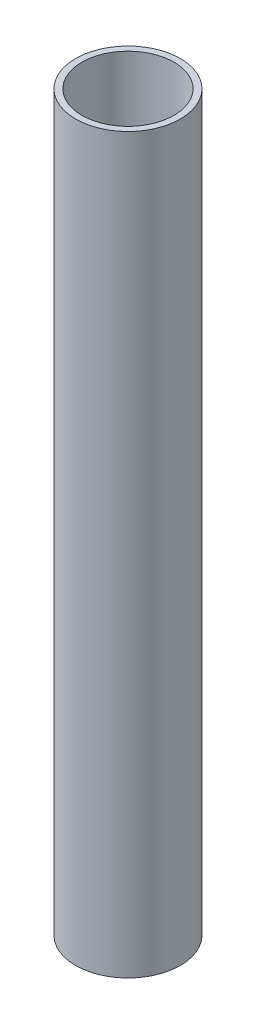
ISO-10303-21;
HEADER;
FILE_DESCRIPTION(('STEP AP214'),'2;1');
FILE_NAME('part.step','',(''),(''),'','','');
FILE_SCHEMA(('AUTOMOTIVE_DESIGN { 1 0 10303 214 1 1 1 1 }'));
ENDSEC;
DATA;
#1=APPLICATION_CONTEXT('core data for automotive mechanical design processes');
#2=APPLICATION_PROTOCOL_DEFINITION('international standard','automotive_design',2000,#1);
#3=PRODUCT_CONTEXT('',#1,'mechanical');
#4=PRODUCT('Part','Part','',(#3));
#5=PRODUCT_RELATED_PRODUCT_CATEGORY('part','',(#4));
#6=PRODUCT_DEFINITION_FORMATION('','',#4);
#7=PRODUCT_DEFINITION_CONTEXT('part definition',#1,'design');
#8=PRODUCT_DEFINITION('design','',#6,#7);
#9=PRODUCT_DEFINITION_SHAPE('','',#8);
#10=(LENGTH_UNIT() NAMED_UNIT(*) SI_UNIT(.MILLI.,.METRE.));
#11=(NAMED_UNIT(*) PLANE_ANGLE_UNIT() SI_UNIT($,.RADIAN.));
#12=(NAMED_UNIT(*) SI_UNIT($,.STERADIAN.) SOLID_ANGLE_UNIT());
#13=UNCERTAINTY_MEASURE_WITH_UNIT(LENGTH_MEASURE(1.E-05),#10,'distance_accuracy_value','');
#14=(GEOMETRIC_REPRESENTATION_CONTEXT(3) GLOBAL_UNCERTAINTY_ASSIGNED_CONTEXT((#13)) GLOBAL_UNIT_ASSIGNED_CONTEXT((#10,
#11,#12)) REPRESENTATION_CONTEXT('',''));
#15=CARTESIAN_POINT('',(0.,0.,0.));
#16=DIRECTION('',(0.,0.,1.));
#17=DIRECTION('',(1.,0.,0.));
#18=AXIS2_PLACEMENT_3D('',#15,#16,#17);
#19=CARTESIAN_POINT('',(0.,175.,0.));
#20=DIRECTION('',(0.,1.,0.));
#21=DIRECTION('',(0.,0.,1.));
#22=AXIS2_PLACEMENT_3D('',#19,#20,#21);
#23=PLANE('',#22);
#24=CARTESIAN_POINT('',(0.,175.,0.));
#25=DIRECTION('',(0.,1.,0.));
#26=DIRECTION('',(0.,0.,1.));
#27=AXIS2_PLACEMENT_3D('',#24,#25,#26);
#28=CIRCLE('',#27,12.5);
#29=CARTESIAN_POINT('',(0.,175.,12.5));
#30=VERTEX_POINT('',#29);
#31=EDGE_CURVE('E10',#30,#30,#28,.T.);
#32=ORIENTED_EDGE('',*,*,#31,.T.);
#33=EDGE_LOOP('',(#32));
#34=FACE_BOUND('',#33,.T.);
#35=CARTESIAN_POINT('',(0.,175.,0.));
#36=DIRECTION('',(0.,1.,0.));
#37=DIRECTION('',(0.,0.,1.));
#38=AXIS2_PLACEMENT_3D('',#35,#36,#37);
#39=CIRCLE('',#38,11.);
#40=CARTESIAN_POINT('',(0.,175.,11.));
#41=VERTEX_POINT('',#40);
#42=EDGE_CURVE('E42',#41,#41,#39,.T.);
#43=ORIENTED_EDGE('',*,*,#42,.F.);
#44=EDGE_LOOP('',(#43));
#45=FACE_BOUND('',#44,.T.);
#46=ADVANCED_FACE('F31',(#34,#45),#23,.T.);
#47=CARTESIAN_POINT('',(0.,0.,0.));
#48=DIRECTION('',(0.,1.,0.));
#49=DIRECTION('',(0.,0.,1.));
#50=AXIS2_PLACEMENT_3D('',#47,#48,#49);
#51=PLANE('',#50);
#52=CARTESIAN_POINT('',(0.,0.,0.));
#53=DIRECTION('',(0.,1.,0.));
#54=DIRECTION('',(0.,0.,1.));
#55=AXIS2_PLACEMENT_3D('',#52,#53,#54);
#56=CIRCLE('',#55,12.5);
#57=CARTESIAN_POINT('',(0.,0.,12.5));
#58=VERTEX_POINT('',#57);
#59=EDGE_CURVE('E35',#58,#58,#56,.T.);
#60=ORIENTED_EDGE('',*,*,#59,.F.);
#61=EDGE_LOOP('',(#60));
#62=FACE_BOUND('',#61,.T.);
#63=CARTESIAN_POINT('',(0.,0.,0.));
#64=DIRECTION('',(0.,1.,0.));
#65=DIRECTION('',(0.,0.,1.));
#66=AXIS2_PLACEMENT_3D('',#63,#64,#65);
#67=CIRCLE('',#66,11.);
#68=CARTESIAN_POINT('',(0.,0.,11.));
#69=VERTEX_POINT('',#68);
#70=EDGE_CURVE('E44',#69,#69,#67,.T.);
#71=ORIENTED_EDGE('',*,*,#70,.T.);
#72=EDGE_LOOP('',(#71));
#73=FACE_BOUND('',#72,.T.);
#74=ADVANCED_FACE('F54',(#62,#73),#51,.F.);
#75=CARTESIAN_POINT('',(0.,175.,0.));
#76=DIRECTION('',(0.,-1.,0.));
#77=DIRECTION('',(0.,0.,-1.));
#78=AXIS2_PLACEMENT_3D('',#75,#76,#77);
#79=CYLINDRICAL_SURFACE('',#78,12.5);
#80=ORIENTED_EDGE('',*,*,#31,.F.);
#81=EDGE_LOOP('',(#80));
#82=FACE_BOUND('',#81,.T.);
#83=ORIENTED_EDGE('',*,*,#59,.T.);
#84=EDGE_LOOP('',(#83));
#85=FACE_BOUND('',#84,.T.);
#86=ADVANCED_FACE('F33',(#82,#85),#79,.T.);
#87=CARTESIAN_POINT('',(0.,175.,0.));
#88=DIRECTION('',(0.,-1.,0.));
#89=DIRECTION('',(0.,0.,-1.));
#90=AXIS2_PLACEMENT_3D('',#87,#88,#89);
#91=CYLINDRICAL_SURFACE('',#90,11.);
#92=ORIENTED_EDGE('',*,*,#42,.T.);
#93=EDGE_LOOP('',(#92));
#94=FACE_BOUND('',#93,.T.);
#95=ORIENTED_EDGE('',*,*,#70,.F.);
#96=EDGE_LOOP('',(#95));
#97=FACE_BOUND('',#96,.T.);
#98=ADVANCED_FACE('F50',(#94,#97),#91,.F.);
#99=CLOSED_SHELL('',(#46,#74,#86,#98));
#100=MANIFOLD_SOLID_BREP('B2',#99);
#101=ADVANCED_BREP_SHAPE_REPRESENTATION('',(#18,#100),#14);
#102=SHAPE_DEFINITION_REPRESENTATION(#9,#101);
ENDSEC;
END-ISO-10303-21;
